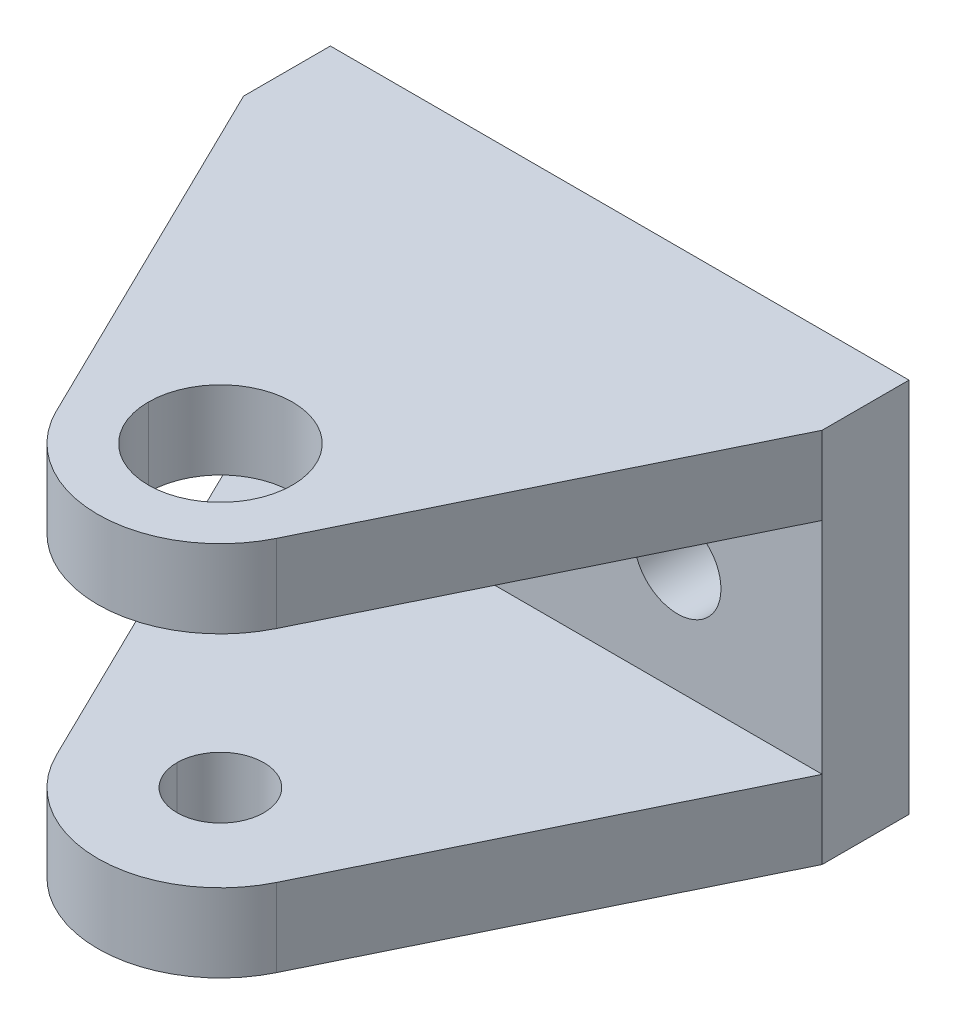
ISO-10303-21;
HEADER;
FILE_DESCRIPTION(('STEP AP214'),'2;1');
FILE_NAME('part.step','',(''),(''),'','','');
FILE_SCHEMA(('AUTOMOTIVE_DESIGN { 1 0 10303 214 1 1 1 1 }'));
ENDSEC;
DATA;
#1=APPLICATION_CONTEXT('core data for automotive mechanical design processes');
#2=APPLICATION_PROTOCOL_DEFINITION('international standard','automotive_design',2000,#1);
#3=PRODUCT_CONTEXT('',#1,'mechanical');
#4=PRODUCT('Part','Part','',(#3));
#5=PRODUCT_RELATED_PRODUCT_CATEGORY('part','',(#4));
#6=PRODUCT_DEFINITION_FORMATION('','',#4);
#7=PRODUCT_DEFINITION_CONTEXT('part definition',#1,'design');
#8=PRODUCT_DEFINITION('design','',#6,#7);
#9=PRODUCT_DEFINITION_SHAPE('','',#8);
#10=(LENGTH_UNIT() NAMED_UNIT(*) SI_UNIT(.MILLI.,.METRE.));
#11=(NAMED_UNIT(*) PLANE_ANGLE_UNIT() SI_UNIT($,.RADIAN.));
#12=(NAMED_UNIT(*) SI_UNIT($,.STERADIAN.) SOLID_ANGLE_UNIT());
#13=UNCERTAINTY_MEASURE_WITH_UNIT(LENGTH_MEASURE(1.E-05),#10,'distance_accuracy_value','');
#14=(GEOMETRIC_REPRESENTATION_CONTEXT(3) GLOBAL_UNCERTAINTY_ASSIGNED_CONTEXT((#13)) GLOBAL_UNIT_ASSIGNED_CONTEXT((#10,
#11,#12)) REPRESENTATION_CONTEXT('',''));
#15=CARTESIAN_POINT('',(0.,0.,0.));
#16=DIRECTION('',(0.,0.,1.));
#17=DIRECTION('',(1.,0.,0.));
#18=AXIS2_PLACEMENT_3D('',#15,#16,#17);
#19=CARTESIAN_POINT('',(5.,3.8,13.8));
#20=DIRECTION('',(0.,1.,0.));
#21=DIRECTION('',(-1.,0.,0.));
#22=AXIS2_PLACEMENT_3D('',#19,#20,#21);
#23=CYLINDRICAL_SURFACE('',#22,2.48870243190225);
#24=CARTESIAN_POINT('',(5.,3.8,13.8));
#25=DIRECTION('',(0.,1.,0.));
#26=DIRECTION('',(-1.,0.,0.));
#27=AXIS2_PLACEMENT_3D('',#24,#25,#26);
#28=CIRCLE('',#27,2.48870243190225);
#29=CARTESIAN_POINT('',(7.48870243190224,3.8,13.8));
#30=VERTEX_POINT('',#29);
#31=CARTESIAN_POINT('',(2.51129756809775,3.8,13.8));
#32=VERTEX_POINT('',#31);
#33=EDGE_CURVE('E42',#30,#32,#28,.T.);
#34=ORIENTED_EDGE('',*,*,#33,.F.);
#35=DIRECTION('',(0.,1.,0.));
#36=VECTOR('',#35,1.);
#37=CARTESIAN_POINT('',(7.48870243190224,3.8,13.8));
#38=LINE('',#37,#36);
#39=CARTESIAN_POINT('',(7.48870243190224,6.5,13.8));
#40=VERTEX_POINT('',#39);
#41=EDGE_CURVE('E11',#30,#40,#38,.T.);
#42=ORIENTED_EDGE('',*,*,#41,.T.);
#43=CARTESIAN_POINT('',(5.,6.5,13.8));
#44=DIRECTION('',(0.,1.,0.));
#45=DIRECTION('',(-1.,0.,0.));
#46=AXIS2_PLACEMENT_3D('',#43,#44,#45);
#47=CIRCLE('',#46,2.48870243190225);
#48=CARTESIAN_POINT('',(2.51129756809775,6.5,13.8));
#49=VERTEX_POINT('',#48);
#50=EDGE_CURVE('E28',#40,#49,#47,.T.);
#51=ORIENTED_EDGE('',*,*,#50,.T.);
#52=DIRECTION('',(0.,1.,0.));
#53=VECTOR('',#52,1.);
#54=CARTESIAN_POINT('',(2.51129756809775,3.8,13.8));
#55=LINE('',#54,#53);
#56=EDGE_CURVE('E83',#32,#49,#55,.T.);
#57=ORIENTED_EDGE('',*,*,#56,.F.);
#58=EDGE_LOOP('',(#34,#42,#51,#57));
#59=FACE_BOUND('',#58,.T.);
#60=ADVANCED_FACE('F17',(#59),#23,.F.);
#61=CARTESIAN_POINT('',(5.,-3.8,13.8));
#62=DIRECTION('',(0.,-1.,0.));
#63=DIRECTION('',(1.,0.,0.));
#64=AXIS2_PLACEMENT_3D('',#61,#62,#63);
#65=CYLINDRICAL_SURFACE('',#64,1.5);
#66=CARTESIAN_POINT('',(5.,-3.8,13.8));
#67=DIRECTION('',(0.,-1.,0.));
#68=DIRECTION('',(1.,0.,0.));
#69=AXIS2_PLACEMENT_3D('',#66,#67,#68);
#70=CIRCLE('',#69,1.5);
#71=CARTESIAN_POINT('',(3.5,-3.8,13.8));
#72=VERTEX_POINT('',#71);
#73=CARTESIAN_POINT('',(6.5,-3.8,13.8));
#74=VERTEX_POINT('',#73);
#75=EDGE_CURVE('E346',#72,#74,#70,.T.);
#76=ORIENTED_EDGE('',*,*,#75,.F.);
#77=DIRECTION('',(0.,-1.,0.));
#78=VECTOR('',#77,1.);
#79=CARTESIAN_POINT('',(3.5,-3.8,13.8));
#80=LINE('',#79,#78);
#81=CARTESIAN_POINT('',(3.5,-6.5,13.8));
#82=VERTEX_POINT('',#81);
#83=EDGE_CURVE('E272',#72,#82,#80,.T.);
#84=ORIENTED_EDGE('',*,*,#83,.T.);
#85=CARTESIAN_POINT('',(5.,-6.5,13.8));
#86=DIRECTION('',(0.,-1.,0.));
#87=DIRECTION('',(1.,0.,0.));
#88=AXIS2_PLACEMENT_3D('',#85,#86,#87);
#89=CIRCLE('',#88,1.5);
#90=CARTESIAN_POINT('',(6.5,-6.5,13.8));
#91=VERTEX_POINT('',#90);
#92=EDGE_CURVE('E252',#82,#91,#89,.T.);
#93=ORIENTED_EDGE('',*,*,#92,.T.);
#94=DIRECTION('',(0.,-1.,0.));
#95=VECTOR('',#94,1.);
#96=CARTESIAN_POINT('',(6.5,-3.8,13.8));
#97=LINE('',#96,#95);
#98=EDGE_CURVE('E295',#74,#91,#97,.T.);
#99=ORIENTED_EDGE('',*,*,#98,.F.);
#100=EDGE_LOOP('',(#76,#84,#93,#99));
#101=FACE_BOUND('',#100,.T.);
#102=ADVANCED_FACE('F420',(#101),#65,.F.);
#103=CARTESIAN_POINT('',(10.,0.,3.));
#104=DIRECTION('',(0.,0.,-1.));
#105=DIRECTION('',(-1.,0.,0.));
#106=AXIS2_PLACEMENT_3D('',#103,#104,#105);
#107=CYLINDRICAL_SURFACE('',#106,1.5);
#108=CARTESIAN_POINT('',(10.,0.,3.));
#109=DIRECTION('',(0.,0.,1.));
#110=DIRECTION('',(1.,0.,0.));
#111=AXIS2_PLACEMENT_3D('',#108,#109,#110);
#112=CIRCLE('',#111,1.5);
#113=CARTESIAN_POINT('',(8.5,0.,3.));
#114=VERTEX_POINT('',#113);
#115=CARTESIAN_POINT('',(11.5,0.,3.));
#116=VERTEX_POINT('',#115);
#117=EDGE_CURVE('E249',#114,#116,#112,.T.);
#118=ORIENTED_EDGE('',*,*,#117,.T.);
#119=DIRECTION('',(0.,0.,-1.));
#120=VECTOR('',#119,1.);
#121=CARTESIAN_POINT('',(11.5,0.,3.));
#122=LINE('',#121,#120);
#123=CARTESIAN_POINT('',(11.5,0.,0.));
#124=VERTEX_POINT('',#123);
#125=EDGE_CURVE('E253',#116,#124,#122,.T.);
#126=ORIENTED_EDGE('',*,*,#125,.T.);
#127=CARTESIAN_POINT('',(10.,0.,0.));
#128=DIRECTION('',(0.,0.,1.));
#129=DIRECTION('',(1.,0.,0.));
#130=AXIS2_PLACEMENT_3D('',#127,#128,#129);
#131=CIRCLE('',#130,1.5);
#132=CARTESIAN_POINT('',(8.5,0.,0.));
#133=VERTEX_POINT('',#132);
#134=EDGE_CURVE('E235',#133,#124,#131,.T.);
#135=ORIENTED_EDGE('',*,*,#134,.F.);
#136=DIRECTION('',(0.,0.,-1.));
#137=VECTOR('',#136,1.);
#138=CARTESIAN_POINT('',(8.5,0.,3.));
#139=LINE('',#138,#137);
#140=EDGE_CURVE('E268',#114,#133,#139,.T.);
#141=ORIENTED_EDGE('',*,*,#140,.F.);
#142=EDGE_LOOP('',(#118,#126,#135,#141));
#143=FACE_BOUND('',#142,.T.);
#144=ADVANCED_FACE('F443',(#143),#107,.F.);
#145=CARTESIAN_POINT('',(0.,0.,3.));
#146=DIRECTION('',(0.,0.,-1.));
#147=DIRECTION('',(-1.,0.,0.));
#148=AXIS2_PLACEMENT_3D('',#145,#146,#147);
#149=CYLINDRICAL_SURFACE('',#148,1.5);
#150=CARTESIAN_POINT('',(0.,0.,3.));
#151=DIRECTION('',(0.,0.,1.));
#152=DIRECTION('',(1.,0.,0.));
#153=AXIS2_PLACEMENT_3D('',#150,#151,#152);
#154=CIRCLE('',#153,1.5);
#155=CARTESIAN_POINT('',(-1.5,0.,3.));
#156=VERTEX_POINT('',#155);
#157=CARTESIAN_POINT('',(1.5,0.,3.));
#158=VERTEX_POINT('',#157);
#159=EDGE_CURVE('E225',#156,#158,#154,.T.);
#160=ORIENTED_EDGE('',*,*,#159,.T.);
#161=DIRECTION('',(0.,0.,-1.));
#162=VECTOR('',#161,1.);
#163=CARTESIAN_POINT('',(1.5,0.,3.));
#164=LINE('',#163,#162);
#165=CARTESIAN_POINT('',(1.5,0.,0.));
#166=VERTEX_POINT('',#165);
#167=EDGE_CURVE('E222',#158,#166,#164,.T.);
#168=ORIENTED_EDGE('',*,*,#167,.T.);
#169=CARTESIAN_POINT('',(0.,0.,0.));
#170=DIRECTION('',(0.,0.,1.));
#171=DIRECTION('',(1.,0.,0.));
#172=AXIS2_PLACEMENT_3D('',#169,#170,#171);
#173=CIRCLE('',#172,1.5);
#174=CARTESIAN_POINT('',(-1.5,0.,0.));
#175=VERTEX_POINT('',#174);
#176=EDGE_CURVE('E211',#175,#166,#173,.T.);
#177=ORIENTED_EDGE('',*,*,#176,.F.);
#178=DIRECTION('',(0.,0.,-1.));
#179=VECTOR('',#178,1.);
#180=CARTESIAN_POINT('',(-1.5,0.,3.));
#181=LINE('',#180,#179);
#182=EDGE_CURVE('E233',#156,#175,#181,.T.);
#183=ORIENTED_EDGE('',*,*,#182,.F.);
#184=EDGE_LOOP('',(#160,#168,#177,#183));
#185=FACE_BOUND('',#184,.T.);
#186=ADVANCED_FACE('F223',(#185),#149,.F.);
#187=CARTESIAN_POINT('',(0.,0.,3.));
#188=DIRECTION('',(0.,0.,1.));
#189=DIRECTION('',(1.,0.,0.));
#190=AXIS2_PLACEMENT_3D('',#187,#188,#189);
#191=PLANE('',#190);
#192=DIRECTION('',(0.,1.,0.));
#193=VECTOR('',#192,1.);
#194=CARTESIAN_POINT('',(15.,-6.5,3.));
#195=LINE('',#194,#193);
#196=CARTESIAN_POINT('',(15.,-3.8,3.));
#197=VERTEX_POINT('',#196);
#198=CARTESIAN_POINT('',(15.,3.8,3.));
#199=VERTEX_POINT('',#198);
#200=EDGE_CURVE('E230',#197,#199,#195,.T.);
#201=ORIENTED_EDGE('',*,*,#200,.T.);
#202=DIRECTION('',(-1.,0.,0.));
#203=VECTOR('',#202,1.);
#204=CARTESIAN_POINT('',(-5.,3.8,3.));
#205=LINE('',#204,#203);
#206=CARTESIAN_POINT('',(-5.,3.8,3.));
#207=VERTEX_POINT('',#206);
#208=EDGE_CURVE('E316',#199,#207,#205,.T.);
#209=ORIENTED_EDGE('',*,*,#208,.T.);
#210=DIRECTION('',(0.,-1.,0.));
#211=VECTOR('',#210,1.);
#212=CARTESIAN_POINT('',(-5.,6.5,3.));
#213=LINE('',#212,#211);
#214=CARTESIAN_POINT('',(-5.,-3.8,3.));
#215=VERTEX_POINT('',#214);
#216=EDGE_CURVE('E335',#207,#215,#213,.T.);
#217=ORIENTED_EDGE('',*,*,#216,.T.);
#218=DIRECTION('',(1.,0.,0.));
#219=VECTOR('',#218,1.);
#220=CARTESIAN_POINT('',(5.,-3.8,3.));
#221=LINE('',#220,#219);
#222=EDGE_CURVE('E219',#215,#197,#221,.T.);
#223=ORIENTED_EDGE('',*,*,#222,.T.);
#224=EDGE_LOOP('',(#201,#209,#217,#223));
#225=FACE_BOUND('',#224,.T.);
#226=ORIENTED_EDGE('',*,*,#159,.F.);
#227=CARTESIAN_POINT('',(0.,0.,3.));
#228=DIRECTION('',(0.,0.,1.));
#229=DIRECTION('',(1.,0.,0.));
#230=AXIS2_PLACEMENT_3D('',#227,#228,#229);
#231=CIRCLE('',#230,1.5);
#232=EDGE_CURVE('E402',#158,#156,#231,.T.);
#233=ORIENTED_EDGE('',*,*,#232,.F.);
#234=EDGE_LOOP('',(#226,#233));
#235=FACE_BOUND('',#234,.T.);
#236=ORIENTED_EDGE('',*,*,#117,.F.);
#237=CARTESIAN_POINT('',(10.,0.,3.));
#238=DIRECTION('',(0.,0.,1.));
#239=DIRECTION('',(1.,0.,0.));
#240=AXIS2_PLACEMENT_3D('',#237,#238,#239);
#241=CIRCLE('',#240,1.5);
#242=EDGE_CURVE('E366',#116,#114,#241,.T.);
#243=ORIENTED_EDGE('',*,*,#242,.F.);
#244=EDGE_LOOP('',(#236,#243));
#245=FACE_BOUND('',#244,.T.);
#246=ADVANCED_FACE('F451',(#225,#235,#245),#191,.T.);
#247=CARTESIAN_POINT('',(0.,0.,0.));
#248=DIRECTION('',(0.,0.,1.));
#249=DIRECTION('',(1.,0.,0.));
#250=AXIS2_PLACEMENT_3D('',#247,#248,#249);
#251=PLANE('',#250);
#252=DIRECTION('',(-1.,0.,0.));
#253=VECTOR('',#252,1.);
#254=CARTESIAN_POINT('',(15.,6.5,0.));
#255=LINE('',#254,#253);
#256=CARTESIAN_POINT('',(15.,6.5,0.));
#257=VERTEX_POINT('',#256);
#258=CARTESIAN_POINT('',(-5.,6.5,0.));
#259=VERTEX_POINT('',#258);
#260=EDGE_CURVE('E322',#257,#259,#255,.T.);
#261=ORIENTED_EDGE('',*,*,#260,.F.);
#262=DIRECTION('',(0.,1.,0.));
#263=VECTOR('',#262,1.);
#264=CARTESIAN_POINT('',(15.,-6.5,0.));
#265=LINE('',#264,#263);
#266=CARTESIAN_POINT('',(15.,-6.5,0.));
#267=VERTEX_POINT('',#266);
#268=EDGE_CURVE('E284',#267,#257,#265,.T.);
#269=ORIENTED_EDGE('',*,*,#268,.F.);
#270=DIRECTION('',(1.,0.,0.));
#271=VECTOR('',#270,1.);
#272=CARTESIAN_POINT('',(15.,-6.5,0.));
#273=LINE('',#272,#271);
#274=CARTESIAN_POINT('',(-5.,-6.5,0.));
#275=VERTEX_POINT('',#274);
#276=EDGE_CURVE('E258',#275,#267,#273,.T.);
#277=ORIENTED_EDGE('',*,*,#276,.F.);
#278=DIRECTION('',(0.,-1.,0.));
#279=VECTOR('',#278,1.);
#280=CARTESIAN_POINT('',(-5.,6.5,0.));
#281=LINE('',#280,#279);
#282=EDGE_CURVE('E300',#259,#275,#281,.T.);
#283=ORIENTED_EDGE('',*,*,#282,.F.);
#284=EDGE_LOOP('',(#261,#269,#277,#283));
#285=FACE_BOUND('',#284,.T.);
#286=ORIENTED_EDGE('',*,*,#176,.T.);
#287=CARTESIAN_POINT('',(0.,0.,0.));
#288=DIRECTION('',(0.,0.,1.));
#289=DIRECTION('',(1.,0.,0.));
#290=AXIS2_PLACEMENT_3D('',#287,#288,#289);
#291=CIRCLE('',#290,1.5);
#292=EDGE_CURVE('E216',#166,#175,#291,.T.);
#293=ORIENTED_EDGE('',*,*,#292,.T.);
#294=EDGE_LOOP('',(#286,#293));
#295=FACE_BOUND('',#294,.T.);
#296=ORIENTED_EDGE('',*,*,#134,.T.);
#297=CARTESIAN_POINT('',(10.,0.,0.));
#298=DIRECTION('',(0.,0.,1.));
#299=DIRECTION('',(1.,0.,0.));
#300=AXIS2_PLACEMENT_3D('',#297,#298,#299);
#301=CIRCLE('',#300,1.5);
#302=EDGE_CURVE('E243',#124,#133,#301,.T.);
#303=ORIENTED_EDGE('',*,*,#302,.T.);
#304=EDGE_LOOP('',(#296,#303));
#305=FACE_BOUND('',#304,.T.);
#306=ADVANCED_FACE('F213',(#285,#295,#305),#251,.F.);
#307=CARTESIAN_POINT('',(15.,6.5,3.));
#308=DIRECTION('',(0.,-1.,0.));
#309=DIRECTION('',(0.,0.,-1.));
#310=AXIS2_PLACEMENT_3D('',#307,#308,#309);
#311=PLANE('',#310);
#312=ORIENTED_EDGE('',*,*,#260,.T.);
#313=DIRECTION('',(0.,0.,-1.));
#314=VECTOR('',#313,1.);
#315=CARTESIAN_POINT('',(-5.,6.5,3.));
#316=LINE('',#315,#314);
#317=CARTESIAN_POINT('',(-5.,6.5,3.));
#318=VERTEX_POINT('',#317);
#319=EDGE_CURVE('E263',#318,#259,#316,.T.);
#320=ORIENTED_EDGE('',*,*,#319,.F.);
#321=DIRECTION('',(0.439227786881589,0.,0.898375729431234));
#322=VECTOR('',#321,1.);
#323=CARTESIAN_POINT('',(-5.,6.5,3.));
#324=LINE('',#323,#322);
#325=CARTESIAN_POINT('',(1.19079958869209,6.5,15.6623685075581));
#326=VERTEX_POINT('',#325);
#327=EDGE_CURVE('E289',#318,#326,#324,.T.);
#328=ORIENTED_EDGE('',*,*,#327,.T.);
#329=CARTESIAN_POINT('',(5.,6.5,13.8));
#330=DIRECTION('',(0.,1.,0.));
#331=DIRECTION('',(-1.,0.,0.));
#332=AXIS2_PLACEMENT_3D('',#329,#330,#331);
#333=CIRCLE('',#332,4.24009719599117);
#334=CARTESIAN_POINT('',(8.8092004113079,6.5,15.6623685075581));
#335=VERTEX_POINT('',#334);
#336=EDGE_CURVE('E285',#326,#335,#333,.T.);
#337=ORIENTED_EDGE('',*,*,#336,.T.);
#338=DIRECTION('',(0.439227786881589,0.,-0.898375729431234));
#339=VECTOR('',#338,1.);
#340=CARTESIAN_POINT('',(15.,6.5,3.));
#341=LINE('',#340,#339);
#342=CARTESIAN_POINT('',(15.,6.5,3.));
#343=VERTEX_POINT('',#342);
#344=EDGE_CURVE('E290',#335,#343,#341,.T.);
#345=ORIENTED_EDGE('',*,*,#344,.T.);
#346=DIRECTION('',(0.,0.,-1.));
#347=VECTOR('',#346,1.);
#348=CARTESIAN_POINT('',(15.,6.5,3.));
#349=LINE('',#348,#347);
#350=EDGE_CURVE('E307',#343,#257,#349,.T.);
#351=ORIENTED_EDGE('',*,*,#350,.T.);
#352=EDGE_LOOP('',(#312,#320,#328,#337,#345,#351));
#353=FACE_BOUND('',#352,.T.);
#354=CARTESIAN_POINT('',(5.,6.5,13.8));
#355=DIRECTION('',(0.,1.,0.));
#356=DIRECTION('',(-1.,0.,0.));
#357=AXIS2_PLACEMENT_3D('',#354,#355,#356);
#358=CIRCLE('',#357,2.48870243190225);
#359=EDGE_CURVE('E247',#49,#40,#358,.T.);
#360=ORIENTED_EDGE('',*,*,#359,.F.);
#361=ORIENTED_EDGE('',*,*,#50,.F.);
#362=EDGE_LOOP('',(#360,#361));
#363=FACE_BOUND('',#362,.T.);
#364=ADVANCED_FACE('F435',(#353,#363),#311,.F.);
#365=CARTESIAN_POINT('',(-5.,6.5,3.));
#366=DIRECTION('',(1.,0.,0.));
#367=DIRECTION('',(0.,1.,0.));
#368=AXIS2_PLACEMENT_3D('',#365,#366,#367);
#369=PLANE('',#368);
#370=ORIENTED_EDGE('',*,*,#282,.T.);
#371=DIRECTION('',(0.,0.,-1.));
#372=VECTOR('',#371,1.);
#373=CARTESIAN_POINT('',(-5.,-6.5,3.));
#374=LINE('',#373,#372);
#375=CARTESIAN_POINT('',(-5.,-6.5,3.));
#376=VERTEX_POINT('',#375);
#377=EDGE_CURVE('E279',#376,#275,#374,.T.);
#378=ORIENTED_EDGE('',*,*,#377,.F.);
#379=DIRECTION('',(0.,-1.,0.));
#380=VECTOR('',#379,1.);
#381=CARTESIAN_POINT('',(-5.,-3.8,3.));
#382=LINE('',#381,#380);
#383=EDGE_CURVE('E173',#215,#376,#382,.T.);
#384=ORIENTED_EDGE('',*,*,#383,.F.);
#385=ORIENTED_EDGE('',*,*,#216,.F.);
#386=DIRECTION('',(0.,-1.,0.));
#387=VECTOR('',#386,1.);
#388=CARTESIAN_POINT('',(-5.,6.5,3.));
#389=LINE('',#388,#387);
#390=EDGE_CURVE('E161',#318,#207,#389,.T.);
#391=ORIENTED_EDGE('',*,*,#390,.F.);
#392=ORIENTED_EDGE('',*,*,#319,.T.);
#393=EDGE_LOOP('',(#370,#378,#384,#385,#391,#392));
#394=FACE_BOUND('',#393,.T.);
#395=ADVANCED_FACE('F425',(#394),#369,.F.);
#396=CARTESIAN_POINT('',(15.,-6.5,3.));
#397=DIRECTION('',(0.,1.,0.));
#398=DIRECTION('',(1.,0.,0.));
#399=AXIS2_PLACEMENT_3D('',#396,#397,#398);
#400=PLANE('',#399);
#401=ORIENTED_EDGE('',*,*,#276,.T.);
#402=DIRECTION('',(0.,0.,-1.));
#403=VECTOR('',#402,1.);
#404=CARTESIAN_POINT('',(15.,-6.5,3.));
#405=LINE('',#404,#403);
#406=CARTESIAN_POINT('',(15.,-6.5,3.));
#407=VERTEX_POINT('',#406);
#408=EDGE_CURVE('E392',#407,#267,#405,.T.);
#409=ORIENTED_EDGE('',*,*,#408,.F.);
#410=DIRECTION('',(-0.43922778688159,0.,0.898375729431234));
#411=VECTOR('',#410,1.);
#412=CARTESIAN_POINT('',(15.,-6.5,3.));
#413=LINE('',#412,#411);
#414=CARTESIAN_POINT('',(8.8092004113079,-6.5,15.6623685075581));
#415=VERTEX_POINT('',#414);
#416=EDGE_CURVE('E254',#407,#415,#413,.T.);
#417=ORIENTED_EDGE('',*,*,#416,.T.);
#418=CARTESIAN_POINT('',(5.,-6.5,13.8));
#419=DIRECTION('',(0.,-1.,0.));
#420=DIRECTION('',(1.,0.,0.));
#421=AXIS2_PLACEMENT_3D('',#418,#419,#420);
#422=CIRCLE('',#421,4.24009719599117);
#423=CARTESIAN_POINT('',(1.19079958869209,-6.5,15.6623685075581));
#424=VERTEX_POINT('',#423);
#425=EDGE_CURVE('E259',#415,#424,#422,.T.);
#426=ORIENTED_EDGE('',*,*,#425,.T.);
#427=DIRECTION('',(-0.439227786881589,0.,-0.898375729431234));
#428=VECTOR('',#427,1.);
#429=CARTESIAN_POINT('',(-5.,-6.5,3.));
#430=LINE('',#429,#428);
#431=EDGE_CURVE('E283',#424,#376,#430,.T.);
#432=ORIENTED_EDGE('',*,*,#431,.T.);
#433=ORIENTED_EDGE('',*,*,#377,.T.);
#434=EDGE_LOOP('',(#401,#409,#417,#426,#432,#433));
#435=FACE_BOUND('',#434,.T.);
#436=CARTESIAN_POINT('',(5.,-6.5,13.8));
#437=DIRECTION('',(0.,-1.,0.));
#438=DIRECTION('',(1.,0.,0.));
#439=AXIS2_PLACEMENT_3D('',#436,#437,#438);
#440=CIRCLE('',#439,1.5);
#441=EDGE_CURVE('E291',#91,#82,#440,.T.);
#442=ORIENTED_EDGE('',*,*,#441,.F.);
#443=ORIENTED_EDGE('',*,*,#92,.F.);
#444=EDGE_LOOP('',(#442,#443));
#445=FACE_BOUND('',#444,.T.);
#446=ADVANCED_FACE('F422',(#435,#445),#400,.F.);
#447=CARTESIAN_POINT('',(15.,-6.5,3.));
#448=DIRECTION('',(-1.,0.,0.));
#449=DIRECTION('',(0.,0.,1.));
#450=AXIS2_PLACEMENT_3D('',#447,#448,#449);
#451=PLANE('',#450);
#452=ORIENTED_EDGE('',*,*,#268,.T.);
#453=ORIENTED_EDGE('',*,*,#350,.F.);
#454=DIRECTION('',(0.,1.,0.));
#455=VECTOR('',#454,1.);
#456=CARTESIAN_POINT('',(15.,3.8,3.));
#457=LINE('',#456,#455);
#458=EDGE_CURVE('E380',#199,#343,#457,.T.);
#459=ORIENTED_EDGE('',*,*,#458,.F.);
#460=ORIENTED_EDGE('',*,*,#200,.F.);
#461=DIRECTION('',(0.,1.,0.));
#462=VECTOR('',#461,1.);
#463=CARTESIAN_POINT('',(15.,-6.5,3.));
#464=LINE('',#463,#462);
#465=EDGE_CURVE('E21',#407,#197,#464,.T.);
#466=ORIENTED_EDGE('',*,*,#465,.F.);
#467=ORIENTED_EDGE('',*,*,#408,.T.);
#468=EDGE_LOOP('',(#452,#453,#459,#460,#466,#467));
#469=FACE_BOUND('',#468,.T.);
#470=ADVANCED_FACE('F424',(#469),#451,.F.);
#471=CARTESIAN_POINT('',(0.,0.,3.));
#472=DIRECTION('',(0.,0.,-1.));
#473=DIRECTION('',(-1.,0.,0.));
#474=AXIS2_PLACEMENT_3D('',#471,#472,#473);
#475=CYLINDRICAL_SURFACE('',#474,1.5);
#476=ORIENTED_EDGE('',*,*,#167,.F.);
#477=ORIENTED_EDGE('',*,*,#232,.T.);
#478=ORIENTED_EDGE('',*,*,#182,.T.);
#479=ORIENTED_EDGE('',*,*,#292,.F.);
#480=EDGE_LOOP('',(#476,#477,#478,#479));
#481=FACE_BOUND('',#480,.T.);
#482=ADVANCED_FACE('F232',(#481),#475,.F.);
#483=CARTESIAN_POINT('',(10.,0.,3.));
#484=DIRECTION('',(0.,0.,-1.));
#485=DIRECTION('',(-1.,0.,0.));
#486=AXIS2_PLACEMENT_3D('',#483,#484,#485);
#487=CYLINDRICAL_SURFACE('',#486,1.5);
#488=ORIENTED_EDGE('',*,*,#125,.F.);
#489=ORIENTED_EDGE('',*,*,#242,.T.);
#490=ORIENTED_EDGE('',*,*,#140,.T.);
#491=ORIENTED_EDGE('',*,*,#302,.F.);
#492=EDGE_LOOP('',(#488,#489,#490,#491));
#493=FACE_BOUND('',#492,.T.);
#494=ADVANCED_FACE('F455',(#493),#487,.F.);
#495=CARTESIAN_POINT('',(-5.,-3.8,3.));
#496=DIRECTION('',(-0.898375729431234,0.,0.439227786881589));
#497=DIRECTION('',(0.,1.,0.));
#498=AXIS2_PLACEMENT_3D('',#495,#496,#497);
#499=PLANE('',#498);
#500=ORIENTED_EDGE('',*,*,#431,.F.);
#501=DIRECTION('',(0.,-1.,0.));
#502=VECTOR('',#501,1.);
#503=CARTESIAN_POINT('',(1.19079958869209,-3.8,15.6623685075581));
#504=LINE('',#503,#502);
#505=CARTESIAN_POINT('',(1.19079958869209,-3.8,15.6623685075581));
#506=VERTEX_POINT('',#505);
#507=EDGE_CURVE('E348',#506,#424,#504,.T.);
#508=ORIENTED_EDGE('',*,*,#507,.F.);
#509=DIRECTION('',(-0.439227786881589,0.,-0.898375729431234));
#510=VECTOR('',#509,1.);
#511=CARTESIAN_POINT('',(-5.,-3.8,3.));
#512=LINE('',#511,#510);
#513=EDGE_CURVE('E264',#506,#215,#512,.T.);
#514=ORIENTED_EDGE('',*,*,#513,.T.);
#515=ORIENTED_EDGE('',*,*,#383,.T.);
#516=EDGE_LOOP('',(#500,#508,#514,#515));
#517=FACE_BOUND('',#516,.T.);
#518=ADVANCED_FACE('F452',(#517),#499,.T.);
#519=CARTESIAN_POINT('',(5.,-3.8,13.8));
#520=DIRECTION('',(0.,-1.,0.));
#521=DIRECTION('',(1.,0.,0.));
#522=AXIS2_PLACEMENT_3D('',#519,#520,#521);
#523=CYLINDRICAL_SURFACE('',#522,4.24009719599117);
#524=ORIENTED_EDGE('',*,*,#425,.F.);
#525=DIRECTION('',(0.,-1.,0.));
#526=VECTOR('',#525,1.);
#527=CARTESIAN_POINT('',(8.8092004113079,-3.8,15.6623685075581));
#528=LINE('',#527,#526);
#529=CARTESIAN_POINT('',(8.8092004113079,-3.8,15.6623685075581));
#530=VERTEX_POINT('',#529);
#531=EDGE_CURVE('E345',#530,#415,#528,.T.);
#532=ORIENTED_EDGE('',*,*,#531,.F.);
#533=CARTESIAN_POINT('',(5.,-3.8,13.8));
#534=DIRECTION('',(0.,-1.,0.));
#535=DIRECTION('',(1.,0.,0.));
#536=AXIS2_PLACEMENT_3D('',#533,#534,#535);
#537=CIRCLE('',#536,4.24009719599117);
#538=EDGE_CURVE('E352',#530,#506,#537,.T.);
#539=ORIENTED_EDGE('',*,*,#538,.T.);
#540=ORIENTED_EDGE('',*,*,#507,.T.);
#541=EDGE_LOOP('',(#524,#532,#539,#540));
#542=FACE_BOUND('',#541,.T.);
#543=ADVANCED_FACE('F454',(#542),#523,.T.);
#544=CARTESIAN_POINT('',(15.,-3.8,3.));
#545=DIRECTION('',(0.898375729431234,0.,0.439227786881589));
#546=DIRECTION('',(0.,-1.,0.));
#547=AXIS2_PLACEMENT_3D('',#544,#545,#546);
#548=PLANE('',#547);
#549=ORIENTED_EDGE('',*,*,#416,.F.);
#550=ORIENTED_EDGE('',*,*,#465,.T.);
#551=DIRECTION('',(-0.43922778688159,0.,0.898375729431234));
#552=VECTOR('',#551,1.);
#553=CARTESIAN_POINT('',(15.,-3.8,3.));
#554=LINE('',#553,#552);
#555=EDGE_CURVE('E360',#197,#530,#554,.T.);
#556=ORIENTED_EDGE('',*,*,#555,.T.);
#557=ORIENTED_EDGE('',*,*,#531,.T.);
#558=EDGE_LOOP('',(#549,#550,#556,#557));
#559=FACE_BOUND('',#558,.T.);
#560=ADVANCED_FACE('F460',(#559),#548,.T.);
#561=CARTESIAN_POINT('',(5.,-3.8,13.8));
#562=DIRECTION('',(0.,-1.,0.));
#563=DIRECTION('',(-1.,0.,0.));
#564=AXIS2_PLACEMENT_3D('',#561,#562,#563);
#565=PLANE('',#564);
#566=ORIENTED_EDGE('',*,*,#222,.F.);
#567=ORIENTED_EDGE('',*,*,#513,.F.);
#568=ORIENTED_EDGE('',*,*,#538,.F.);
#569=ORIENTED_EDGE('',*,*,#555,.F.);
#570=EDGE_LOOP('',(#566,#567,#568,#569));
#571=FACE_BOUND('',#570,.T.);
#572=CARTESIAN_POINT('',(5.,-3.8,13.8));
#573=DIRECTION('',(0.,-1.,0.));
#574=DIRECTION('',(1.,0.,0.));
#575=AXIS2_PLACEMENT_3D('',#572,#573,#574);
#576=CIRCLE('',#575,1.5);
#577=EDGE_CURVE('E342',#74,#72,#576,.T.);
#578=ORIENTED_EDGE('',*,*,#577,.T.);
#579=ORIENTED_EDGE('',*,*,#75,.T.);
#580=EDGE_LOOP('',(#578,#579));
#581=FACE_BOUND('',#580,.T.);
#582=ADVANCED_FACE('F458',(#571,#581),#565,.F.);
#583=CARTESIAN_POINT('',(5.,-3.8,13.8));
#584=DIRECTION('',(0.,-1.,0.));
#585=DIRECTION('',(1.,0.,0.));
#586=AXIS2_PLACEMENT_3D('',#583,#584,#585);
#587=CYLINDRICAL_SURFACE('',#586,1.5);
#588=ORIENTED_EDGE('',*,*,#83,.F.);
#589=ORIENTED_EDGE('',*,*,#577,.F.);
#590=ORIENTED_EDGE('',*,*,#98,.T.);
#591=ORIENTED_EDGE('',*,*,#441,.T.);
#592=EDGE_LOOP('',(#588,#589,#590,#591));
#593=FACE_BOUND('',#592,.T.);
#594=ADVANCED_FACE('F417',(#593),#587,.F.);
#595=CARTESIAN_POINT('',(-5.,3.8,3.));
#596=DIRECTION('',(-0.898375729431234,0.,0.439227786881589));
#597=DIRECTION('',(0.,1.,0.));
#598=AXIS2_PLACEMENT_3D('',#595,#596,#597);
#599=PLANE('',#598);
#600=ORIENTED_EDGE('',*,*,#327,.F.);
#601=ORIENTED_EDGE('',*,*,#390,.T.);
#602=DIRECTION('',(0.439227786881589,0.,0.898375729431234));
#603=VECTOR('',#602,1.);
#604=CARTESIAN_POINT('',(-5.,3.8,3.));
#605=LINE('',#604,#603);
#606=CARTESIAN_POINT('',(1.19079958869209,3.8,15.6623685075581));
#607=VERTEX_POINT('',#606);
#608=EDGE_CURVE('E332',#207,#607,#605,.T.);
#609=ORIENTED_EDGE('',*,*,#608,.T.);
#610=DIRECTION('',(0.,1.,0.));
#611=VECTOR('',#610,1.);
#612=CARTESIAN_POINT('',(1.19079958869209,3.8,15.6623685075581));
#613=LINE('',#612,#611);
#614=EDGE_CURVE('E132',#607,#326,#613,.T.);
#615=ORIENTED_EDGE('',*,*,#614,.T.);
#616=EDGE_LOOP('',(#600,#601,#609,#615));
#617=FACE_BOUND('',#616,.T.);
#618=ADVANCED_FACE('F19',(#617),#599,.T.);
#619=CARTESIAN_POINT('',(15.,3.8,3.));
#620=DIRECTION('',(0.898375729431234,0.,0.439227786881589));
#621=DIRECTION('',(0.,-1.,0.));
#622=AXIS2_PLACEMENT_3D('',#619,#620,#621);
#623=PLANE('',#622);
#624=ORIENTED_EDGE('',*,*,#344,.F.);
#625=DIRECTION('',(0.,1.,0.));
#626=VECTOR('',#625,1.);
#627=CARTESIAN_POINT('',(8.8092004113079,3.8,15.6623685075581));
#628=LINE('',#627,#626);
#629=CARTESIAN_POINT('',(8.8092004113079,3.8,15.6623685075581));
#630=VERTEX_POINT('',#629);
#631=EDGE_CURVE('E118',#630,#335,#628,.T.);
#632=ORIENTED_EDGE('',*,*,#631,.F.);
#633=DIRECTION('',(0.439227786881589,0.,-0.898375729431234));
#634=VECTOR('',#633,1.);
#635=CARTESIAN_POINT('',(15.,3.8,3.));
#636=LINE('',#635,#634);
#637=EDGE_CURVE('E358',#630,#199,#636,.T.);
#638=ORIENTED_EDGE('',*,*,#637,.T.);
#639=ORIENTED_EDGE('',*,*,#458,.T.);
#640=EDGE_LOOP('',(#624,#632,#638,#639));
#641=FACE_BOUND('',#640,.T.);
#642=ADVANCED_FACE('F447',(#641),#623,.T.);
#643=CARTESIAN_POINT('',(5.,3.8,13.8));
#644=DIRECTION('',(0.,1.,0.));
#645=DIRECTION('',(-1.,0.,0.));
#646=AXIS2_PLACEMENT_3D('',#643,#644,#645);
#647=CYLINDRICAL_SURFACE('',#646,4.24009719599117);
#648=ORIENTED_EDGE('',*,*,#336,.F.);
#649=ORIENTED_EDGE('',*,*,#614,.F.);
#650=CARTESIAN_POINT('',(5.,3.8,13.8));
#651=DIRECTION('',(0.,1.,0.));
#652=DIRECTION('',(-1.,0.,0.));
#653=AXIS2_PLACEMENT_3D('',#650,#651,#652);
#654=CIRCLE('',#653,4.24009719599117);
#655=EDGE_CURVE('E331',#607,#630,#654,.T.);
#656=ORIENTED_EDGE('',*,*,#655,.T.);
#657=ORIENTED_EDGE('',*,*,#631,.T.);
#658=EDGE_LOOP('',(#648,#649,#656,#657));
#659=FACE_BOUND('',#658,.T.);
#660=ADVANCED_FACE('F469',(#659),#647,.T.);
#661=CARTESIAN_POINT('',(5.,3.8,13.8));
#662=DIRECTION('',(0.,1.,0.));
#663=DIRECTION('',(1.,0.,0.));
#664=AXIS2_PLACEMENT_3D('',#661,#662,#663);
#665=PLANE('',#664);
#666=ORIENTED_EDGE('',*,*,#608,.F.);
#667=ORIENTED_EDGE('',*,*,#208,.F.);
#668=ORIENTED_EDGE('',*,*,#637,.F.);
#669=ORIENTED_EDGE('',*,*,#655,.F.);
#670=EDGE_LOOP('',(#666,#667,#668,#669));
#671=FACE_BOUND('',#670,.T.);
#672=CARTESIAN_POINT('',(5.,3.8,13.8));
#673=DIRECTION('',(0.,1.,0.));
#674=DIRECTION('',(-1.,0.,0.));
#675=AXIS2_PLACEMENT_3D('',#672,#673,#674);
#676=CIRCLE('',#675,2.48870243190225);
#677=EDGE_CURVE('E278',#32,#30,#676,.T.);
#678=ORIENTED_EDGE('',*,*,#677,.T.);
#679=ORIENTED_EDGE('',*,*,#33,.T.);
#680=EDGE_LOOP('',(#678,#679));
#681=FACE_BOUND('',#680,.T.);
#682=ADVANCED_FACE('F522',(#671,#681),#665,.F.);
#683=CARTESIAN_POINT('',(5.,3.8,13.8));
#684=DIRECTION('',(0.,1.,0.));
#685=DIRECTION('',(-1.,0.,0.));
#686=AXIS2_PLACEMENT_3D('',#683,#684,#685);
#687=CYLINDRICAL_SURFACE('',#686,2.48870243190225);
#688=ORIENTED_EDGE('',*,*,#41,.F.);
#689=ORIENTED_EDGE('',*,*,#677,.F.);
#690=ORIENTED_EDGE('',*,*,#56,.T.);
#691=ORIENTED_EDGE('',*,*,#359,.T.);
#692=EDGE_LOOP('',(#688,#689,#690,#691));
#693=FACE_BOUND('',#692,.T.);
#694=ADVANCED_FACE('F527',(#693),#687,.F.);
#695=CLOSED_SHELL('',(#60,#102,#144,#186,#246,#306,#364,#395,#446,#470,#482,#494,#518,#543,#560,
#582,#594,#618,#642,#660,#682,#694));
#696=MANIFOLD_SOLID_BREP('B1',#695);
#697=ADVANCED_BREP_SHAPE_REPRESENTATION('',(#18,#696),#14);
#698=SHAPE_DEFINITION_REPRESENTATION(#9,#697);
ENDSEC;
END-ISO-10303-21;
